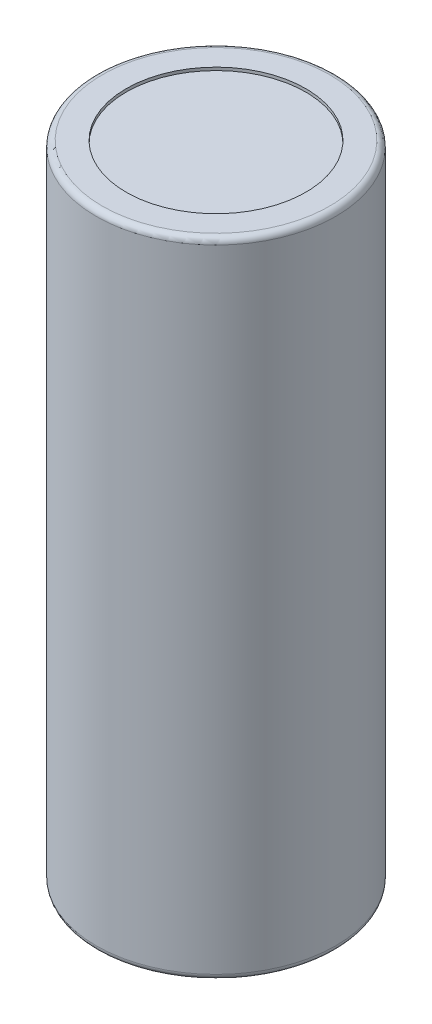
ISO-10303-21;
HEADER;
FILE_DESCRIPTION(('STEP AP214'),'2;1');
FILE_NAME('part.step','',(''),(''),'','','');
FILE_SCHEMA(('AUTOMOTIVE_DESIGN { 1 0 10303 214 1 1 1 1 }'));
ENDSEC;
DATA;
#1=APPLICATION_CONTEXT('core data for automotive mechanical design processes');
#2=APPLICATION_PROTOCOL_DEFINITION('international standard','automotive_design',2000,#1);
#3=PRODUCT_CONTEXT('',#1,'mechanical');
#4=PRODUCT('Part','Part','',(#3));
#5=PRODUCT_RELATED_PRODUCT_CATEGORY('part','',(#4));
#6=PRODUCT_DEFINITION_FORMATION('','',#4);
#7=PRODUCT_DEFINITION_CONTEXT('part definition',#1,'design');
#8=PRODUCT_DEFINITION('design','',#6,#7);
#9=PRODUCT_DEFINITION_SHAPE('','',#8);
#10=(LENGTH_UNIT() NAMED_UNIT(*) SI_UNIT(.MILLI.,.METRE.));
#11=(NAMED_UNIT(*) PLANE_ANGLE_UNIT() SI_UNIT($,.RADIAN.));
#12=(NAMED_UNIT(*) SI_UNIT($,.STERADIAN.) SOLID_ANGLE_UNIT());
#13=UNCERTAINTY_MEASURE_WITH_UNIT(LENGTH_MEASURE(1.E-05),#10,'distance_accuracy_value','');
#14=(GEOMETRIC_REPRESENTATION_CONTEXT(3) GLOBAL_UNCERTAINTY_ASSIGNED_CONTEXT((#13)) GLOBAL_UNIT_ASSIGNED_CONTEXT((#10,
#11,#12)) REPRESENTATION_CONTEXT('',''));
#15=CARTESIAN_POINT('',(0.,0.,0.));
#16=DIRECTION('',(0.,0.,1.));
#17=DIRECTION('',(1.,0.,0.));
#18=AXIS2_PLACEMENT_3D('',#15,#16,#17);
#19=CARTESIAN_POINT('',(75.0000011175871,21.4,6.00000008940696));
#20=DIRECTION('',(0.,-1.,0.));
#21=DIRECTION('',(-1.,0.,0.));
#22=AXIS2_PLACEMENT_3D('',#19,#20,#21);
#23=PLANE('',#22);
#24=CARTESIAN_POINT('',(75.0000011175871,21.4,6.00000008940696));
#25=DIRECTION('',(0.,-1.,0.));
#26=DIRECTION('',(1.,0.,0.));
#27=AXIS2_PLACEMENT_3D('',#24,#25,#26);
#28=CIRCLE('',#27,3.00000004470348);
#29=CARTESIAN_POINT('',(72.0000010728836,21.4,6.00000008940696));
#30=VERTEX_POINT('',#29);
#31=EDGE_CURVE('E11',#30,#30,#28,.T.);
#32=ORIENTED_EDGE('',*,*,#31,.F.);
#33=EDGE_LOOP('',(#32));
#34=FACE_BOUND('',#33,.T.);
#35=ADVANCED_FACE('F16',(#34),#23,.F.);
#36=CARTESIAN_POINT('',(75.0000011175871,21.45,6.00000008940696));
#37=DIRECTION('',(0.,-1.,0.));
#38=DIRECTION('',(1.,0.,0.));
#39=AXIS2_PLACEMENT_3D('',#36,#37,#38);
#40=CYLINDRICAL_SURFACE('',#39,3.00000004470348);
#41=CARTESIAN_POINT('',(75.0000011175871,21.5,6.00000008940696));
#42=DIRECTION('',(0.,-1.,0.));
#43=DIRECTION('',(1.,0.,0.));
#44=AXIS2_PLACEMENT_3D('',#41,#42,#43);
#45=CIRCLE('',#44,3.00000004470348);
#46=CARTESIAN_POINT('',(72.0000010728836,21.5,6.00000008940696));
#47=VERTEX_POINT('',#46);
#48=EDGE_CURVE('E111',#47,#47,#45,.T.);
#49=ORIENTED_EDGE('',*,*,#48,.F.);
#50=DIRECTION('',(0.,-1.,0.));
#51=VECTOR('',#50,1.);
#52=CARTESIAN_POINT('',(72.0000010728836,21.45,6.00000008940696));
#53=LINE('',#52,#51);
#54=EDGE_CURVE('E26',#47,#30,#53,.T.);
#55=ORIENTED_EDGE('',*,*,#54,.T.);
#56=ORIENTED_EDGE('',*,*,#31,.T.);
#57=ORIENTED_EDGE('',*,*,#54,.F.);
#58=EDGE_LOOP('',(#49,#55,#56,#57));
#59=FACE_BOUND('',#58,.T.);
#60=ADVANCED_FACE('F201',(#59),#40,.F.);
#61=CARTESIAN_POINT('',(75.0000011175871,0.,6.00000008940697));
#62=DIRECTION('',(0.,-1.,0.));
#63=DIRECTION('',(-1.,0.,0.));
#64=AXIS2_PLACEMENT_3D('',#61,#62,#63);
#65=PLANE('',#64);
#66=CARTESIAN_POINT('',(75.0000011175871,0.,6.00000008940697));
#67=DIRECTION('',(0.,1.,0.));
#68=DIRECTION('',(1.,0.,0.));
#69=AXIS2_PLACEMENT_3D('',#66,#67,#68);
#70=CIRCLE('',#69,3.8);
#71=CARTESIAN_POINT('',(75.0000011175871,0.,2.20000008940697));
#72=VERTEX_POINT('',#71);
#73=EDGE_CURVE('E108',#72,#72,#70,.T.);
#74=ORIENTED_EDGE('',*,*,#73,.F.);
#75=EDGE_LOOP('',(#74));
#76=FACE_BOUND('',#75,.T.);
#77=ADVANCED_FACE('F191',(#76),#65,.T.);
#78=CARTESIAN_POINT('',(75.0000011175871,0.2,6.00000008940697));
#79=DIRECTION('',(0.,1.,0.));
#80=DIRECTION('',(0.,0.,1.));
#81=AXIS2_PLACEMENT_3D('',#78,#79,#80);
#82=TOROIDAL_SURFACE('',#81,3.8,0.2);
#83=CARTESIAN_POINT('',(75.0000011175871,0.2,6.00000008940697));
#84=DIRECTION('',(0.,-1.,0.));
#85=DIRECTION('',(1.,0.,0.));
#86=AXIS2_PLACEMENT_3D('',#83,#84,#85);
#87=CIRCLE('',#86,4.);
#88=CARTESIAN_POINT('',(71.0000011175871,0.2,6.00000008940697));
#89=VERTEX_POINT('',#88);
#90=CARTESIAN_POINT('',(75.0000011175871,0.2,2.00000008940697));
#91=VERTEX_POINT('',#90);
#92=EDGE_CURVE('E71',#89,#91,#87,.T.);
#93=ORIENTED_EDGE('',*,*,#92,.T.);
#94=CARTESIAN_POINT('',(75.0000011175871,0.2,2.20000008940697));
#95=DIRECTION('',(-1.,0.,0.));
#96=DIRECTION('',(0.,0.,-1.));
#97=AXIS2_PLACEMENT_3D('',#94,#95,#96);
#98=CIRCLE('',#97,0.2);
#99=EDGE_CURVE('E19',#91,#72,#98,.T.);
#100=ORIENTED_EDGE('',*,*,#99,.T.);
#101=ORIENTED_EDGE('',*,*,#73,.T.);
#102=ORIENTED_EDGE('',*,*,#99,.F.);
#103=CARTESIAN_POINT('',(75.0000011175871,0.2,6.00000008940697));
#104=DIRECTION('',(0.,-1.,0.));
#105=DIRECTION('',(1.,0.,0.));
#106=AXIS2_PLACEMENT_3D('',#103,#104,#105);
#107=CIRCLE('',#106,4.);
#108=EDGE_CURVE('E101',#91,#89,#107,.T.);
#109=ORIENTED_EDGE('',*,*,#108,.T.);
#110=EDGE_LOOP('',(#93,#100,#101,#102,#109));
#111=FACE_BOUND('',#110,.T.);
#112=ADVANCED_FACE('F116',(#111),#82,.T.);
#113=CARTESIAN_POINT('',(75.0000011175871,21.5,6.00000008940696));
#114=DIRECTION('',(0.,1.,0.));
#115=DIRECTION('',(0.,0.,-1.));
#116=AXIS2_PLACEMENT_3D('',#113,#114,#115);
#117=PLANE('',#116);
#118=ORIENTED_EDGE('',*,*,#48,.T.);
#119=EDGE_LOOP('',(#118));
#120=FACE_BOUND('',#119,.T.);
#121=CARTESIAN_POINT('',(75.0000011175871,21.5,6.00000008940696));
#122=DIRECTION('',(0.,-1.,0.));
#123=DIRECTION('',(1.,0.,0.));
#124=AXIS2_PLACEMENT_3D('',#121,#122,#123);
#125=CIRCLE('',#124,3.8);
#126=CARTESIAN_POINT('',(75.0000011175871,21.5,9.80000008940696));
#127=VERTEX_POINT('',#126);
#128=EDGE_CURVE('E85',#127,#127,#125,.T.);
#129=ORIENTED_EDGE('',*,*,#128,.F.);
#130=EDGE_LOOP('',(#129));
#131=FACE_BOUND('',#130,.T.);
#132=ADVANCED_FACE('F171',(#120,#131),#117,.T.);
#133=CARTESIAN_POINT('',(75.0000011175871,10.75,6.00000008940697));
#134=DIRECTION('',(0.,1.,0.));
#135=DIRECTION('',(1.,0.,0.));
#136=AXIS2_PLACEMENT_3D('',#133,#134,#135);
#137=CYLINDRICAL_SURFACE('',#136,4.);
#138=CARTESIAN_POINT('',(75.0000011175871,21.3,6.00000008940696));
#139=DIRECTION('',(0.,1.,0.));
#140=DIRECTION('',(1.,0.,0.));
#141=AXIS2_PLACEMENT_3D('',#138,#139,#140);
#142=CIRCLE('',#141,4.);
#143=CARTESIAN_POINT('',(71.0000011175871,21.3,6.00000008940696));
#144=VERTEX_POINT('',#143);
#145=CARTESIAN_POINT('',(75.0000011175871,21.3,10.000000089407));
#146=VERTEX_POINT('',#145);
#147=EDGE_CURVE('E81',#144,#146,#142,.T.);
#148=ORIENTED_EDGE('',*,*,#147,.F.);
#149=DIRECTION('',(0.,-1.,0.));
#150=VECTOR('',#149,1.);
#151=CARTESIAN_POINT('',(71.0000011175871,10.75,6.00000008940697));
#152=LINE('',#151,#150);
#153=EDGE_CURVE('E82',#144,#89,#152,.T.);
#154=ORIENTED_EDGE('',*,*,#153,.T.);
#155=ORIENTED_EDGE('',*,*,#108,.F.);
#156=ORIENTED_EDGE('',*,*,#92,.F.);
#157=ORIENTED_EDGE('',*,*,#153,.F.);
#158=CARTESIAN_POINT('',(75.0000011175871,21.3,6.00000008940696));
#159=DIRECTION('',(0.,1.,0.));
#160=DIRECTION('',(1.,0.,0.));
#161=AXIS2_PLACEMENT_3D('',#158,#159,#160);
#162=CIRCLE('',#161,4.);
#163=EDGE_CURVE('E76',#146,#144,#162,.T.);
#164=ORIENTED_EDGE('',*,*,#163,.F.);
#165=EDGE_LOOP('',(#148,#154,#155,#156,#157,#164));
#166=FACE_BOUND('',#165,.T.);
#167=ADVANCED_FACE('F78',(#166),#137,.T.);
#168=CARTESIAN_POINT('',(75.0000011175871,21.3,6.00000008940696));
#169=DIRECTION('',(0.,-1.,0.));
#170=DIRECTION('',(0.,0.,-1.));
#171=AXIS2_PLACEMENT_3D('',#168,#169,#170);
#172=TOROIDAL_SURFACE('',#171,3.8,0.2);
#173=ORIENTED_EDGE('',*,*,#147,.T.);
#174=CARTESIAN_POINT('',(75.0000011175871,21.3,9.80000008940696));
#175=DIRECTION('',(-1.,0.,0.));
#176=DIRECTION('',(0.,0.,1.));
#177=AXIS2_PLACEMENT_3D('',#174,#175,#176);
#178=CIRCLE('',#177,0.2);
#179=EDGE_CURVE('E88',#146,#127,#178,.T.);
#180=ORIENTED_EDGE('',*,*,#179,.T.);
#181=ORIENTED_EDGE('',*,*,#128,.T.);
#182=ORIENTED_EDGE('',*,*,#179,.F.);
#183=ORIENTED_EDGE('',*,*,#163,.T.);
#184=EDGE_LOOP('',(#173,#180,#181,#182,#183));
#185=FACE_BOUND('',#184,.T.);
#186=ADVANCED_FACE('F89',(#185),#172,.T.);
#187=CLOSED_SHELL('',(#35,#60,#77,#112,#132,#167,#186));
#188=MANIFOLD_SOLID_BREP('B1',#187);
#189=ADVANCED_BREP_SHAPE_REPRESENTATION('',(#18,#188),#14);
#190=SHAPE_DEFINITION_REPRESENTATION(#9,#189);
ENDSEC;
END-ISO-10303-21;
